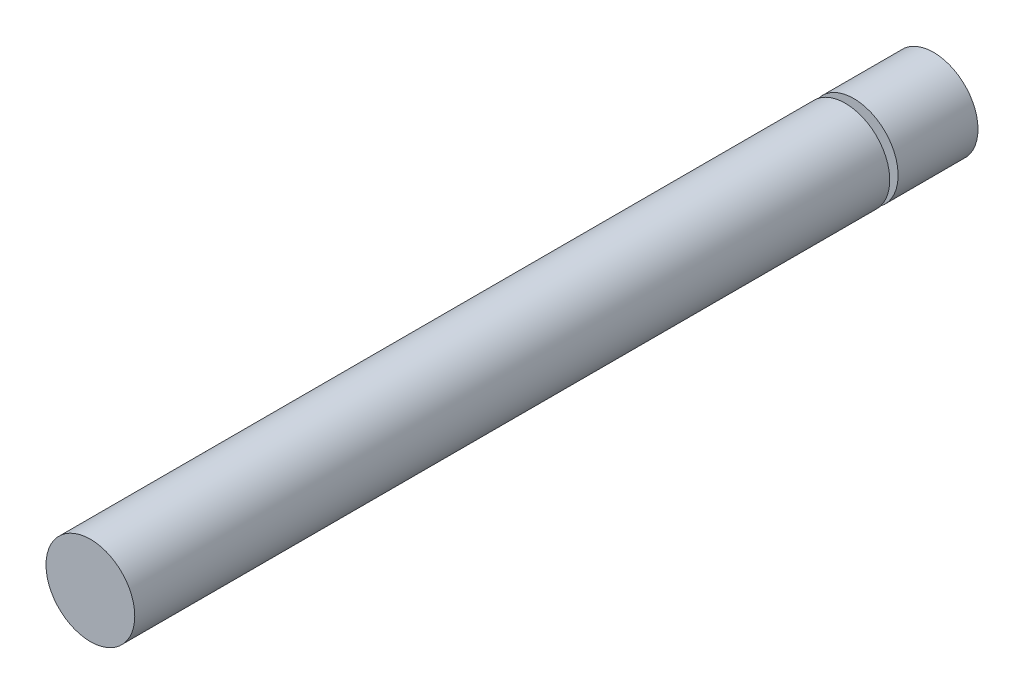
ISO-10303-21;
HEADER;
FILE_DESCRIPTION(('STEP AP214'),'2;1');
FILE_NAME('part.step','',(''),(''),'','','');
FILE_SCHEMA(('AUTOMOTIVE_DESIGN { 1 0 10303 214 1 1 1 1 }'));
ENDSEC;
DATA;
#1=APPLICATION_CONTEXT('core data for automotive mechanical design processes');
#2=APPLICATION_PROTOCOL_DEFINITION('international standard','automotive_design',2000,#1);
#3=PRODUCT_CONTEXT('',#1,'mechanical');
#4=PRODUCT('Part','Part','',(#3));
#5=PRODUCT_RELATED_PRODUCT_CATEGORY('part','',(#4));
#6=PRODUCT_DEFINITION_FORMATION('','',#4);
#7=PRODUCT_DEFINITION_CONTEXT('part definition',#1,'design');
#8=PRODUCT_DEFINITION('design','',#6,#7);
#9=PRODUCT_DEFINITION_SHAPE('','',#8);
#10=(LENGTH_UNIT() NAMED_UNIT(*) SI_UNIT(.MILLI.,.METRE.));
#11=(NAMED_UNIT(*) PLANE_ANGLE_UNIT() SI_UNIT($,.RADIAN.));
#12=(NAMED_UNIT(*) SI_UNIT($,.STERADIAN.) SOLID_ANGLE_UNIT());
#13=UNCERTAINTY_MEASURE_WITH_UNIT(LENGTH_MEASURE(1.E-05),#10,'distance_accuracy_value','');
#14=(GEOMETRIC_REPRESENTATION_CONTEXT(3) GLOBAL_UNCERTAINTY_ASSIGNED_CONTEXT((#13)) GLOBAL_UNIT_ASSIGNED_CONTEXT((#10,
#11,#12)) REPRESENTATION_CONTEXT('',''));
#15=CARTESIAN_POINT('',(0.,0.,0.));
#16=DIRECTION('',(0.,0.,1.));
#17=DIRECTION('',(1.,0.,0.));
#18=AXIS2_PLACEMENT_3D('',#15,#16,#17);
#19=CARTESIAN_POINT('',(0.,0.,47.5));
#20=DIRECTION('',(0.,0.,-1.));
#21=DIRECTION('',(-1.,0.,0.));
#22=AXIS2_PLACEMENT_3D('',#19,#20,#21);
#23=CYLINDRICAL_SURFACE('',#22,5.);
#24=CARTESIAN_POINT('',(0.,0.,-38.5));
#25=DIRECTION('',(0.,0.,-1.));
#26=DIRECTION('',(-1.,0.,0.));
#27=AXIS2_PLACEMENT_3D('',#24,#25,#26);
#28=CIRCLE('',#27,5.);
#29=CARTESIAN_POINT('',(-5.,0.,-38.5));
#30=VERTEX_POINT('',#29);
#31=EDGE_CURVE('E48',#30,#30,#28,.T.);
#32=ORIENTED_EDGE('',*,*,#31,.T.);
#33=EDGE_LOOP('',(#32));
#34=FACE_BOUND('',#33,.T.);
#35=CARTESIAN_POINT('',(0.,0.,-47.5));
#36=DIRECTION('',(0.,0.,1.));
#37=DIRECTION('',(1.,0.,0.));
#38=AXIS2_PLACEMENT_3D('',#35,#36,#37);
#39=CIRCLE('',#38,5.);
#40=CARTESIAN_POINT('',(5.,0.,-47.5));
#41=VERTEX_POINT('',#40);
#42=EDGE_CURVE('E41',#41,#41,#39,.T.);
#43=ORIENTED_EDGE('',*,*,#42,.T.);
#44=EDGE_LOOP('',(#43));
#45=FACE_BOUND('',#44,.T.);
#46=ADVANCED_FACE('F37',(#34,#45),#23,.T.);
#47=CARTESIAN_POINT('',(0.,0.,-47.5));
#48=DIRECTION('',(0.,0.,1.));
#49=DIRECTION('',(1.,0.,0.));
#50=AXIS2_PLACEMENT_3D('',#47,#48,#49);
#51=PLANE('',#50);
#52=ORIENTED_EDGE('',*,*,#42,.F.);
#53=EDGE_LOOP('',(#52));
#54=FACE_BOUND('',#53,.T.);
#55=ADVANCED_FACE('F73',(#54),#51,.F.);
#56=CARTESIAN_POINT('',(-5.,0.,-38.5));
#57=DIRECTION('',(0.,0.,-1.));
#58=DIRECTION('',(-1.,0.,0.));
#59=AXIS2_PLACEMENT_3D('',#56,#57,#58);
#60=PLANE('',#59);
#61=ORIENTED_EDGE('',*,*,#31,.F.);
#62=EDGE_LOOP('',(#61));
#63=FACE_BOUND('',#62,.T.);
#64=CARTESIAN_POINT('',(0.,0.,-38.5));
#65=DIRECTION('',(0.,0.,-1.));
#66=DIRECTION('',(-1.,0.,0.));
#67=AXIS2_PLACEMENT_3D('',#64,#65,#66);
#68=CIRCLE('',#67,3.5);
#69=CARTESIAN_POINT('',(-3.5,0.,-38.5));
#70=VERTEX_POINT('',#69);
#71=EDGE_CURVE('E52',#70,#70,#68,.T.);
#72=ORIENTED_EDGE('',*,*,#71,.T.);
#73=EDGE_LOOP('',(#72));
#74=FACE_BOUND('',#73,.T.);
#75=ADVANCED_FACE('F79',(#63,#74),#60,.F.);
#76=CARTESIAN_POINT('',(0.,0.,-47.5));
#77=DIRECTION('',(0.,0.,-1.));
#78=DIRECTION('',(-1.,0.,0.));
#79=AXIS2_PLACEMENT_3D('',#76,#77,#78);
#80=CYLINDRICAL_SURFACE('',#79,3.5);
#81=ORIENTED_EDGE('',*,*,#71,.F.);
#82=EDGE_LOOP('',(#81));
#83=FACE_BOUND('',#82,.T.);
#84=CARTESIAN_POINT('',(0.,0.,-37.56));
#85=DIRECTION('',(0.,0.,-1.));
#86=DIRECTION('',(-1.,0.,0.));
#87=AXIS2_PLACEMENT_3D('',#84,#85,#86);
#88=CIRCLE('',#87,3.5);
#89=CARTESIAN_POINT('',(-3.5,0.,-37.56));
#90=VERTEX_POINT('',#89);
#91=EDGE_CURVE('E55',#90,#90,#88,.T.);
#92=ORIENTED_EDGE('',*,*,#91,.T.);
#93=EDGE_LOOP('',(#92));
#94=FACE_BOUND('',#93,.T.);
#95=ADVANCED_FACE('F86',(#83,#94),#80,.T.);
#96=CARTESIAN_POINT('',(-5.,0.,-37.56));
#97=DIRECTION('',(0.,0.,1.));
#98=DIRECTION('',(1.,0.,0.));
#99=AXIS2_PLACEMENT_3D('',#96,#97,#98);
#100=PLANE('',#99);
#101=ORIENTED_EDGE('',*,*,#91,.F.);
#102=EDGE_LOOP('',(#101));
#103=FACE_BOUND('',#102,.T.);
#104=CARTESIAN_POINT('',(0.,0.,-37.56));
#105=DIRECTION('',(0.,0.,-1.));
#106=DIRECTION('',(-1.,0.,0.));
#107=AXIS2_PLACEMENT_3D('',#104,#105,#106);
#108=CIRCLE('',#107,5.);
#109=CARTESIAN_POINT('',(-5.,0.,-37.56));
#110=VERTEX_POINT('',#109);
#111=EDGE_CURVE('E58',#110,#110,#108,.T.);
#112=ORIENTED_EDGE('',*,*,#111,.T.);
#113=EDGE_LOOP('',(#112));
#114=FACE_BOUND('',#113,.T.);
#115=ADVANCED_FACE('F62',(#103,#114),#100,.F.);
#116=CARTESIAN_POINT('',(0.,0.,47.5));
#117=DIRECTION('',(0.,0.,1.));
#118=DIRECTION('',(1.,0.,0.));
#119=AXIS2_PLACEMENT_3D('',#116,#117,#118);
#120=PLANE('',#119);
#121=CARTESIAN_POINT('',(0.,0.,47.5));
#122=DIRECTION('',(0.,0.,1.));
#123=DIRECTION('',(1.,0.,0.));
#124=AXIS2_PLACEMENT_3D('',#121,#122,#123);
#125=CIRCLE('',#124,5.);
#126=CARTESIAN_POINT('',(5.,0.,47.5));
#127=VERTEX_POINT('',#126);
#128=EDGE_CURVE('E10',#127,#127,#125,.T.);
#129=ORIENTED_EDGE('',*,*,#128,.T.);
#130=EDGE_LOOP('',(#129));
#131=FACE_BOUND('',#130,.T.);
#132=ADVANCED_FACE('F66',(#131),#120,.T.);
#133=ORIENTED_EDGE('',*,*,#111,.F.);
#134=EDGE_LOOP('',(#133));
#135=FACE_BOUND('',#134,.T.);
#136=ORIENTED_EDGE('',*,*,#128,.F.);
#137=EDGE_LOOP('',(#136));
#138=FACE_BOUND('',#137,.T.);
#139=ADVANCED_FACE('F39',(#135,#138),#23,.T.);
#140=CLOSED_SHELL('',(#46,#55,#75,#95,#115,#132,#139));
#141=MANIFOLD_SOLID_BREP('B2',#140);
#142=ADVANCED_BREP_SHAPE_REPRESENTATION('',(#18,#141),#14);
#143=SHAPE_DEFINITION_REPRESENTATION(#9,#142);
ENDSEC;
END-ISO-10303-21;
